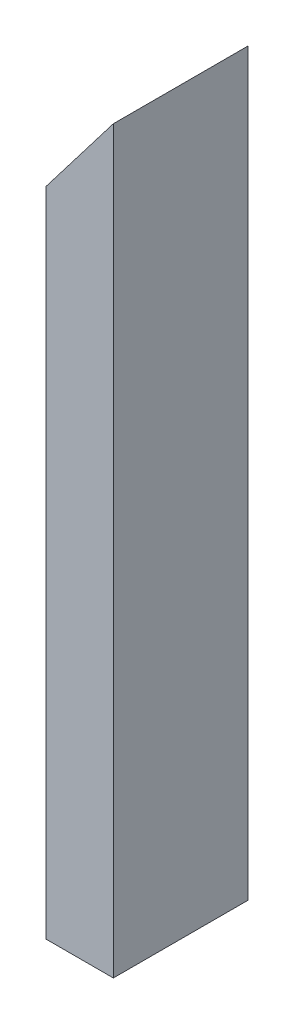
ISO-10303-21;
HEADER;
FILE_DESCRIPTION(('STEP AP214'),'2;1');
FILE_NAME('part.step','',(''),(''),'','','');
FILE_SCHEMA(('AUTOMOTIVE_DESIGN { 1 0 10303 214 1 1 1 1 }'));
ENDSEC;
DATA;
#1=APPLICATION_CONTEXT('core data for automotive mechanical design processes');
#2=APPLICATION_PROTOCOL_DEFINITION('international standard','automotive_design',2000,#1);
#3=PRODUCT_CONTEXT('',#1,'mechanical');
#4=PRODUCT('Part','Part','',(#3));
#5=PRODUCT_RELATED_PRODUCT_CATEGORY('part','',(#4));
#6=PRODUCT_DEFINITION_FORMATION('','',#4);
#7=PRODUCT_DEFINITION_CONTEXT('part definition',#1,'design');
#8=PRODUCT_DEFINITION('design','',#6,#7);
#9=PRODUCT_DEFINITION_SHAPE('','',#8);
#10=(LENGTH_UNIT() NAMED_UNIT(*) SI_UNIT(.MILLI.,.METRE.));
#11=(NAMED_UNIT(*) PLANE_ANGLE_UNIT() SI_UNIT($,.RADIAN.));
#12=(NAMED_UNIT(*) SI_UNIT($,.STERADIAN.) SOLID_ANGLE_UNIT());
#13=UNCERTAINTY_MEASURE_WITH_UNIT(LENGTH_MEASURE(1.E-05),#10,'distance_accuracy_value','');
#14=(GEOMETRIC_REPRESENTATION_CONTEXT(3) GLOBAL_UNCERTAINTY_ASSIGNED_CONTEXT((#13)) GLOBAL_UNIT_ASSIGNED_CONTEXT((#10,
#11,#12)) REPRESENTATION_CONTEXT('',''));
#15=CARTESIAN_POINT('',(0.,0.,0.));
#16=DIRECTION('',(0.,0.,1.));
#17=DIRECTION('',(1.,0.,0.));
#18=AXIS2_PLACEMENT_3D('',#15,#16,#17);
#19=CARTESIAN_POINT('',(-6.34999999994852,-71.0083768892483,25.4));
#20=DIRECTION('',(1.,0.,0.));
#21=DIRECTION('',(0.,1.,0.));
#22=AXIS2_PLACEMENT_3D('',#19,#20,#21);
#23=PLANE('',#22);
#24=DIRECTION('',(0.,-1.,0.));
#25=VECTOR('',#24,1.);
#26=CARTESIAN_POINT('',(-6.34999999994852,-71.0083768892483,0.));
#27=LINE('',#26,#25);
#28=CARTESIAN_POINT('',(-6.34999999994835,51.9879414662121,0.));
#29=VERTEX_POINT('',#28);
#30=CARTESIAN_POINT('',(-6.34999999994852,-71.0083768892483,0.));
#31=VERTEX_POINT('',#30);
#32=EDGE_CURVE('E114',#29,#31,#27,.T.);
#33=ORIENTED_EDGE('',*,*,#32,.T.);
#34=DIRECTION('',(0.,0.,-1.));
#35=VECTOR('',#34,1.);
#36=CARTESIAN_POINT('',(-6.34999999994852,-71.0083768892483,25.4));
#37=LINE('',#36,#35);
#38=CARTESIAN_POINT('',(-6.34999999994852,-71.0083768892483,25.4));
#39=VERTEX_POINT('',#38);
#40=EDGE_CURVE('E11',#39,#31,#37,.T.);
#41=ORIENTED_EDGE('',*,*,#40,.F.);
#42=DIRECTION('',(0.,-1.,0.));
#43=VECTOR('',#42,1.);
#44=CARTESIAN_POINT('',(-6.34999999994852,-71.0083768892483,25.4));
#45=LINE('',#44,#43);
#46=CARTESIAN_POINT('',(-6.34999999994835,51.9879414662121,25.4));
#47=VERTEX_POINT('',#46);
#48=EDGE_CURVE('E115',#47,#39,#45,.T.);
#49=ORIENTED_EDGE('',*,*,#48,.F.);
#50=DIRECTION('',(0.,0.,-1.));
#51=VECTOR('',#50,1.);
#52=CARTESIAN_POINT('',(-6.34999999994835,51.9879414662121,25.4));
#53=LINE('',#52,#51);
#54=EDGE_CURVE('E121',#47,#29,#53,.T.);
#55=ORIENTED_EDGE('',*,*,#54,.T.);
#56=EDGE_LOOP('',(#33,#41,#49,#55));
#57=FACE_BOUND('',#56,.T.);
#58=ADVANCED_FACE('F31',(#57),#23,.F.);
#59=CARTESIAN_POINT('',(6.35000000005149,-71.0083768892483,25.4));
#60=DIRECTION('',(0.,1.,0.));
#61=DIRECTION('',(0.,0.,1.));
#62=AXIS2_PLACEMENT_3D('',#59,#60,#61);
#63=PLANE('',#62);
#64=CARTESIAN_POINT('',(-0.00307494132757019,-71.0083768892487,12.7));
#65=DIRECTION('',(0.,-1.,0.));
#66=DIRECTION('',(0.,0.,-1.));
#67=AXIS2_PLACEMENT_3D('',#64,#65,#66);
#68=CIRCLE('',#67,3.175);
#69=CARTESIAN_POINT('',(-0.00307494132757019,-71.0083768892487,9.525));
#70=VERTEX_POINT('',#69);
#71=EDGE_CURVE('E161',#70,#70,#68,.T.);
#72=ORIENTED_EDGE('',*,*,#71,.F.);
#73=EDGE_LOOP('',(#72));
#74=FACE_BOUND('',#73,.T.);
#75=DIRECTION('',(1.,0.,0.));
#76=VECTOR('',#75,1.);
#77=CARTESIAN_POINT('',(6.35000000005149,-71.0083768892483,0.));
#78=LINE('',#77,#76);
#79=CARTESIAN_POINT('',(6.35000000005149,-71.0083768892483,0.));
#80=VERTEX_POINT('',#79);
#81=EDGE_CURVE('E124',#31,#80,#78,.T.);
#82=ORIENTED_EDGE('',*,*,#81,.T.);
#83=DIRECTION('',(0.,0.,-1.));
#84=VECTOR('',#83,1.);
#85=CARTESIAN_POINT('',(6.35000000005149,-71.0083768892483,25.4));
#86=LINE('',#85,#84);
#87=CARTESIAN_POINT('',(6.35000000005149,-71.0083768892483,25.4));
#88=VERTEX_POINT('',#87);
#89=EDGE_CURVE('E39',#88,#80,#86,.T.);
#90=ORIENTED_EDGE('',*,*,#89,.F.);
#91=DIRECTION('',(1.,0.,0.));
#92=VECTOR('',#91,1.);
#93=CARTESIAN_POINT('',(6.35000000005149,-71.0083768892483,25.4));
#94=LINE('',#93,#92);
#95=EDGE_CURVE('E78',#39,#88,#94,.T.);
#96=ORIENTED_EDGE('',*,*,#95,.F.);
#97=ORIENTED_EDGE('',*,*,#40,.T.);
#98=EDGE_LOOP('',(#82,#90,#96,#97));
#99=FACE_BOUND('',#98,.T.);
#100=ADVANCED_FACE('F148',(#74,#99),#63,.F.);
#101=CARTESIAN_POINT('',(6.35000000005165,68.5808387469121,25.4));
#102=DIRECTION('',(-1.,0.,0.));
#103=DIRECTION('',(0.,-1.,0.));
#104=AXIS2_PLACEMENT_3D('',#101,#102,#103);
#105=PLANE('',#104);
#106=DIRECTION('',(0.,1.,0.));
#107=VECTOR('',#106,1.);
#108=CARTESIAN_POINT('',(6.35000000005165,68.5808387469121,0.));
#109=LINE('',#108,#107);
#110=CARTESIAN_POINT('',(6.35000000005165,68.5808387469121,0.));
#111=VERTEX_POINT('',#110);
#112=EDGE_CURVE('E65',#80,#111,#109,.T.);
#113=ORIENTED_EDGE('',*,*,#112,.T.);
#114=DIRECTION('',(0.,0.,-1.));
#115=VECTOR('',#114,1.);
#116=CARTESIAN_POINT('',(6.35000000005165,68.5808387469121,25.4));
#117=LINE('',#116,#115);
#118=CARTESIAN_POINT('',(6.35000000005165,68.5808387469121,25.4));
#119=VERTEX_POINT('',#118);
#120=EDGE_CURVE('E129',#119,#111,#117,.T.);
#121=ORIENTED_EDGE('',*,*,#120,.F.);
#122=DIRECTION('',(0.,1.,0.));
#123=VECTOR('',#122,1.);
#124=CARTESIAN_POINT('',(6.35000000005165,68.5808387469121,25.4));
#125=LINE('',#124,#123);
#126=EDGE_CURVE('E118',#88,#119,#125,.T.);
#127=ORIENTED_EDGE('',*,*,#126,.F.);
#128=ORIENTED_EDGE('',*,*,#89,.T.);
#129=EDGE_LOOP('',(#113,#121,#127,#128));
#130=FACE_BOUND('',#129,.T.);
#131=ADVANCED_FACE('F131',(#130),#105,.F.);
#132=CARTESIAN_POINT('',(-6.34999999994835,51.9879414662121,25.4));
#133=DIRECTION('',(0.794096490407281,-0.607791710969177,0.));
#134=DIRECTION('',(0.607791710969177,0.794096490407281,0.));
#135=AXIS2_PLACEMENT_3D('',#132,#133,#134);
#136=PLANE('',#135);
#137=CARTESIAN_POINT('',(-0.989310869971118,58.9918284022338,12.7));
#138=DIRECTION('',(-0.794096490407281,0.607791710969177,0.));
#139=DIRECTION('',(-0.607791710969177,-0.794096490407281,0.));
#140=AXIS2_PLACEMENT_3D('',#137,#138,#139);
#141=CIRCLE('',#140,2.413);
#142=CARTESIAN_POINT('',(-2.45591226853974,57.0756735708811,12.7));
#143=VERTEX_POINT('',#142);
#144=EDGE_CURVE('E95',#143,#143,#141,.T.);
#145=ORIENTED_EDGE('',*,*,#144,.F.);
#146=EDGE_LOOP('',(#145));
#147=FACE_BOUND('',#146,.T.);
#148=DIRECTION('',(-0.607791710969177,-0.794096490407281,0.));
#149=VECTOR('',#148,1.);
#150=CARTESIAN_POINT('',(-6.34999999994835,51.9879414662121,0.));
#151=LINE('',#150,#149);
#152=EDGE_CURVE('E71',#111,#29,#151,.T.);
#153=ORIENTED_EDGE('',*,*,#152,.T.);
#154=ORIENTED_EDGE('',*,*,#54,.F.);
#155=DIRECTION('',(-0.607791710969177,-0.794096490407281,0.));
#156=VECTOR('',#155,1.);
#157=CARTESIAN_POINT('',(-6.34999999994835,51.9879414662121,25.4));
#158=LINE('',#157,#156);
#159=EDGE_CURVE('E47',#119,#47,#158,.T.);
#160=ORIENTED_EDGE('',*,*,#159,.F.);
#161=ORIENTED_EDGE('',*,*,#120,.T.);
#162=EDGE_LOOP('',(#153,#154,#160,#161));
#163=FACE_BOUND('',#162,.T.);
#164=ADVANCED_FACE('F138',(#147,#163),#136,.F.);
#165=CARTESIAN_POINT('',(-6.34999999994852,-71.0083768892483,25.4));
#166=DIRECTION('',(0.,0.,1.));
#167=DIRECTION('',(1.,0.,0.));
#168=AXIS2_PLACEMENT_3D('',#165,#166,#167);
#169=PLANE('',#168);
#170=ORIENTED_EDGE('',*,*,#48,.T.);
#171=ORIENTED_EDGE('',*,*,#95,.T.);
#172=ORIENTED_EDGE('',*,*,#126,.T.);
#173=ORIENTED_EDGE('',*,*,#159,.T.);
#174=EDGE_LOOP('',(#170,#171,#172,#173));
#175=FACE_BOUND('',#174,.T.);
#176=ADVANCED_FACE('F140',(#175),#169,.T.);
#177=CARTESIAN_POINT('',(-6.34999999994852,-71.0083768892483,0.));
#178=DIRECTION('',(0.,0.,1.));
#179=DIRECTION('',(1.,0.,0.));
#180=AXIS2_PLACEMENT_3D('',#177,#178,#179);
#181=PLANE('',#180);
#182=ORIENTED_EDGE('',*,*,#32,.F.);
#183=ORIENTED_EDGE('',*,*,#152,.F.);
#184=ORIENTED_EDGE('',*,*,#112,.F.);
#185=ORIENTED_EDGE('',*,*,#81,.F.);
#186=EDGE_LOOP('',(#182,#183,#184,#185));
#187=FACE_BOUND('',#186,.T.);
#188=ADVANCED_FACE('F134',(#187),#181,.F.);
#189=CARTESIAN_POINT('',(4.25490235267857,54.9779719429934,12.7));
#190=DIRECTION('',(-0.794096490407281,0.607791710969177,0.));
#191=DIRECTION('',(-0.607791710969177,-0.794096490407281,0.));
#192=AXIS2_PLACEMENT_3D('',#189,#190,#191);
#193=CONICAL_SURFACE('',#192,1.89865,1.02974425867666);
#194=CARTESIAN_POINT('',(5.16082669861979,54.2845885634171,12.7));
#195=VERTEX_POINT('',#194);
#196=VERTEX_LOOP('',#195);
#197=FACE_BOUND('',#196,.T.);
#198=CARTESIAN_POINT('',(4.25490235267857,54.9779719429934,12.7));
#199=DIRECTION('',(-0.794096490407281,0.607791710969177,0.));
#200=DIRECTION('',(-0.607791710969177,-0.794096490407281,0.));
#201=AXIS2_PLACEMENT_3D('',#198,#199,#200);
#202=CIRCLE('',#201,1.89865);
#203=CARTESIAN_POINT('',(3.10091862064694,53.4702606414816,12.7));
#204=VERTEX_POINT('',#203);
#205=EDGE_CURVE('E111',#204,#204,#202,.T.);
#206=ORIENTED_EDGE('',*,*,#205,.T.);
#207=EDGE_LOOP('',(#206));
#208=FACE_BOUND('',#207,.T.);
#209=ADVANCED_FACE('F190',(#197,#208),#193,.F.);
#210=CARTESIAN_POINT('',(-0.989310869971116,58.9918284022338,12.7));
#211=DIRECTION('',(-0.794096490407281,0.607791710969177,0.));
#212=DIRECTION('',(-0.607791710969177,-0.794096490407281,0.));
#213=AXIS2_PLACEMENT_3D('',#210,#211,#212);
#214=CYLINDRICAL_SURFACE('',#213,1.89865);
#215=ORIENTED_EDGE('',*,*,#205,.F.);
#216=EDGE_LOOP('',(#215));
#217=FACE_BOUND('',#216,.T.);
#218=CARTESIAN_POINT('',(1.63279574135373,56.9849001726136,12.7));
#219=DIRECTION('',(-0.794096490407281,0.607791710969177,0.));
#220=DIRECTION('',(-0.607791710969177,-0.794096490407281,0.));
#221=AXIS2_PLACEMENT_3D('',#218,#219,#220);
#222=CIRCLE('',#221,1.89865);
#223=CARTESIAN_POINT('',(0.478812009322099,55.4771888711018,12.7));
#224=VERTEX_POINT('',#223);
#225=EDGE_CURVE('E108',#224,#224,#222,.T.);
#226=ORIENTED_EDGE('',*,*,#225,.T.);
#227=EDGE_LOOP('',(#226));
#228=FACE_BOUND('',#227,.T.);
#229=ADVANCED_FACE('F186',(#217,#228),#214,.F.);
#230=CARTESIAN_POINT('',(1.63279574135372,56.9849001726136,14.59865));
#231=DIRECTION('',(0.794096490407281,-0.607791710969177,0.));
#232=DIRECTION('',(0.607791710969177,0.794096490407281,0.));
#233=AXIS2_PLACEMENT_3D('',#230,#231,#232);
#234=PLANE('',#233);
#235=ORIENTED_EDGE('',*,*,#225,.F.);
#236=EDGE_LOOP('',(#235));
#237=FACE_BOUND('',#236,.T.);
#238=CARTESIAN_POINT('',(1.63279574135373,56.9849001726136,12.7));
#239=DIRECTION('',(-0.794096490407281,0.607791710969177,0.));
#240=DIRECTION('',(-0.607791710969177,-0.794096490407281,0.));
#241=AXIS2_PLACEMENT_3D('',#238,#239,#240);
#242=CIRCLE('',#241,2.413);
#243=CARTESIAN_POINT('',(0.166194342785103,55.0687453412609,12.7));
#244=VERTEX_POINT('',#243);
#245=EDGE_CURVE('E99',#244,#244,#242,.T.);
#246=ORIENTED_EDGE('',*,*,#245,.T.);
#247=EDGE_LOOP('',(#246));
#248=FACE_BOUND('',#247,.T.);
#249=ADVANCED_FACE('F182',(#237,#248),#234,.F.);
#250=CARTESIAN_POINT('',(-0.989310869971116,58.9918284022338,12.7));
#251=DIRECTION('',(-0.794096490407281,0.607791710969177,0.));
#252=DIRECTION('',(-0.607791710969177,-0.794096490407281,0.));
#253=AXIS2_PLACEMENT_3D('',#250,#251,#252);
#254=CYLINDRICAL_SURFACE('',#253,2.413);
#255=ORIENTED_EDGE('',*,*,#245,.F.);
#256=EDGE_LOOP('',(#255));
#257=FACE_BOUND('',#256,.T.);
#258=ORIENTED_EDGE('',*,*,#144,.T.);
#259=EDGE_LOOP('',(#258));
#260=FACE_BOUND('',#259,.T.);
#261=ADVANCED_FACE('F89',(#257,#260),#254,.F.);
#262=CARTESIAN_POINT('',(-0.00307494132757019,-54.4983768892487,12.7));
#263=DIRECTION('',(0.,-1.,0.));
#264=DIRECTION('',(0.,0.,-1.));
#265=AXIS2_PLACEMENT_3D('',#262,#263,#264);
#266=CONICAL_SURFACE('',#265,2.55269999999999,1.02974425867665);
#267=CARTESIAN_POINT('',(-0.00307494132757461,-52.9645599870571,12.7));
#268=VERTEX_POINT('',#267);
#269=VERTEX_LOOP('',#268);
#270=FACE_BOUND('',#269,.T.);
#271=CARTESIAN_POINT('',(-0.00307494132757019,-54.4983768892487,12.7));
#272=DIRECTION('',(0.,-1.,0.));
#273=DIRECTION('',(0.,0.,-1.));
#274=AXIS2_PLACEMENT_3D('',#271,#272,#273);
#275=CIRCLE('',#274,2.55269999999999);
#276=CARTESIAN_POINT('',(-0.00307494132757019,-54.4983768892487,10.1473));
#277=VERTEX_POINT('',#276);
#278=EDGE_CURVE('E93',#277,#277,#275,.T.);
#279=ORIENTED_EDGE('',*,*,#278,.T.);
#280=EDGE_LOOP('',(#279));
#281=FACE_BOUND('',#280,.T.);
#282=ADVANCED_FACE('F85',(#270,#281),#266,.F.);
#283=CARTESIAN_POINT('',(-0.00307494132757019,-71.0083768892487,12.7));
#284=DIRECTION('',(0.,-1.,0.));
#285=DIRECTION('',(0.,0.,-1.));
#286=AXIS2_PLACEMENT_3D('',#283,#284,#285);
#287=CYLINDRICAL_SURFACE('',#286,2.5527);
#288=ORIENTED_EDGE('',*,*,#278,.F.);
#289=EDGE_LOOP('',(#288));
#290=FACE_BOUND('',#289,.T.);
#291=CARTESIAN_POINT('',(-0.00307494132757019,-58.3083768892487,12.7));
#292=DIRECTION('',(0.,-1.,0.));
#293=DIRECTION('',(0.,0.,-1.));
#294=AXIS2_PLACEMENT_3D('',#291,#292,#293);
#295=CIRCLE('',#294,2.5527);
#296=CARTESIAN_POINT('',(-0.00307494132757019,-58.3083768892487,10.1473));
#297=VERTEX_POINT('',#296);
#298=EDGE_CURVE('E96',#297,#297,#295,.T.);
#299=ORIENTED_EDGE('',*,*,#298,.T.);
#300=EDGE_LOOP('',(#299));
#301=FACE_BOUND('',#300,.T.);
#302=ADVANCED_FACE('F88',(#290,#301),#287,.F.);
#303=CARTESIAN_POINT('',(2.54962505867243,-58.3083768892487,12.7));
#304=DIRECTION('',(0.,1.,0.));
#305=DIRECTION('',(0.,0.,1.));
#306=AXIS2_PLACEMENT_3D('',#303,#304,#305);
#307=PLANE('',#306);
#308=ORIENTED_EDGE('',*,*,#298,.F.);
#309=EDGE_LOOP('',(#308));
#310=FACE_BOUND('',#309,.T.);
#311=CARTESIAN_POINT('',(-0.00307494132757019,-58.3083768892487,12.7));
#312=DIRECTION('',(0.,-1.,0.));
#313=DIRECTION('',(0.,0.,-1.));
#314=AXIS2_PLACEMENT_3D('',#311,#312,#313);
#315=CIRCLE('',#314,3.175);
#316=CARTESIAN_POINT('',(-0.00307494132757019,-58.3083768892487,9.525));
#317=VERTEX_POINT('',#316);
#318=EDGE_CURVE('E102',#317,#317,#315,.T.);
#319=ORIENTED_EDGE('',*,*,#318,.T.);
#320=EDGE_LOOP('',(#319));
#321=FACE_BOUND('',#320,.T.);
#322=ADVANCED_FACE('F167',(#310,#321),#307,.F.);
#323=CARTESIAN_POINT('',(-0.00307494132757019,-71.0083768892487,12.7));
#324=DIRECTION('',(0.,-1.,0.));
#325=DIRECTION('',(0.,0.,-1.));
#326=AXIS2_PLACEMENT_3D('',#323,#324,#325);
#327=CYLINDRICAL_SURFACE('',#326,3.175);
#328=ORIENTED_EDGE('',*,*,#318,.F.);
#329=EDGE_LOOP('',(#328));
#330=FACE_BOUND('',#329,.T.);
#331=ORIENTED_EDGE('',*,*,#71,.T.);
#332=EDGE_LOOP('',(#331));
#333=FACE_BOUND('',#332,.T.);
#334=ADVANCED_FACE('F169',(#330,#333),#327,.F.);
#335=CLOSED_SHELL('',(#58,#100,#131,#164,#176,#188,#209,#229,#249,#261,#282,#302,#322,#334));
#336=MANIFOLD_SOLID_BREP('B2',#335);
#337=ADVANCED_BREP_SHAPE_REPRESENTATION('',(#18,#336),#14);
#338=SHAPE_DEFINITION_REPRESENTATION(#9,#337);
ENDSEC;
END-ISO-10303-21;
